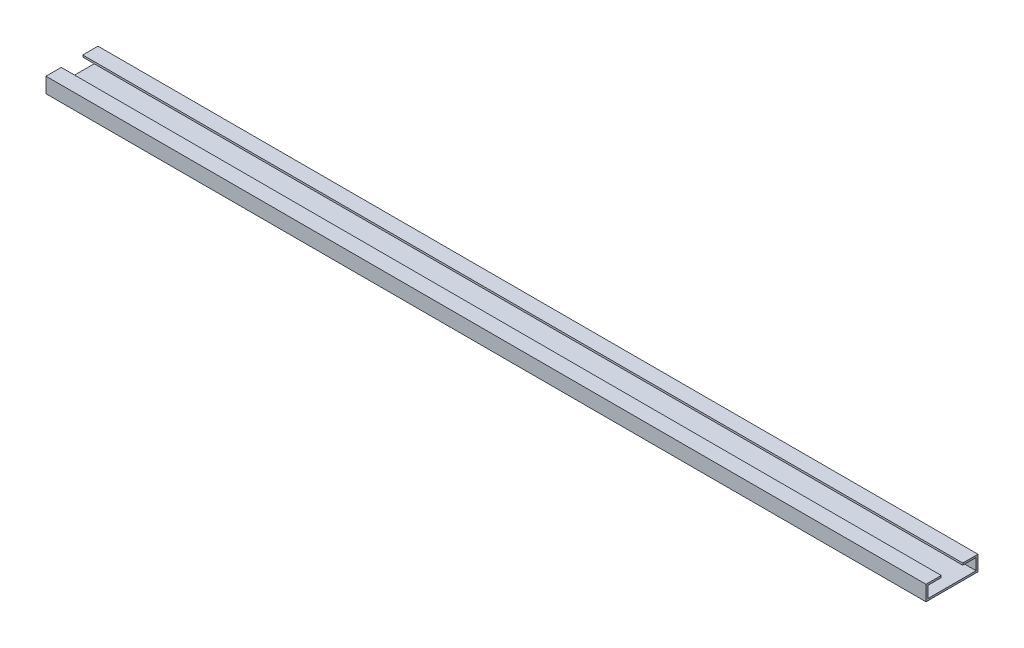
ISO-10303-21;
HEADER;
FILE_DESCRIPTION(('STEP AP214'),'2;1');
FILE_NAME('part.step','',(''),(''),'','','');
FILE_SCHEMA(('AUTOMOTIVE_DESIGN { 1 0 10303 214 1 1 1 1 }'));
ENDSEC;
DATA;
#1=APPLICATION_CONTEXT('core data for automotive mechanical design processes');
#2=APPLICATION_PROTOCOL_DEFINITION('international standard','automotive_design',2000,#1);
#3=PRODUCT_CONTEXT('',#1,'mechanical');
#4=PRODUCT('Part','Part','',(#3));
#5=PRODUCT_RELATED_PRODUCT_CATEGORY('part','',(#4));
#6=PRODUCT_DEFINITION_FORMATION('','',#4);
#7=PRODUCT_DEFINITION_CONTEXT('part definition',#1,'design');
#8=PRODUCT_DEFINITION('design','',#6,#7);
#9=PRODUCT_DEFINITION_SHAPE('','',#8);
#10=(LENGTH_UNIT() NAMED_UNIT(*) SI_UNIT(.MILLI.,.METRE.));
#11=(NAMED_UNIT(*) PLANE_ANGLE_UNIT() SI_UNIT($,.RADIAN.));
#12=(NAMED_UNIT(*) SI_UNIT($,.STERADIAN.) SOLID_ANGLE_UNIT());
#13=UNCERTAINTY_MEASURE_WITH_UNIT(LENGTH_MEASURE(1.E-05),#10,'distance_accuracy_value','');
#14=(GEOMETRIC_REPRESENTATION_CONTEXT(3) GLOBAL_UNCERTAINTY_ASSIGNED_CONTEXT((#13)) GLOBAL_UNIT_ASSIGNED_CONTEXT((#10,
#11,#12)) REPRESENTATION_CONTEXT('',''));
#15=CARTESIAN_POINT('',(0.,0.,0.));
#16=DIRECTION('',(0.,0.,1.));
#17=DIRECTION('',(1.,0.,0.));
#18=AXIS2_PLACEMENT_3D('',#15,#16,#17);
#19=CARTESIAN_POINT('',(370.,0.,-13.65));
#20=DIRECTION('',(0.,-1.,0.));
#21=DIRECTION('',(0.,0.,-1.));
#22=AXIS2_PLACEMENT_3D('',#19,#20,#21);
#23=PLANE('',#22);
#24=DIRECTION('',(-1.,0.,0.));
#25=VECTOR('',#24,1.);
#26=CARTESIAN_POINT('',(370.,0.,0.));
#27=LINE('',#26,#25);
#28=CARTESIAN_POINT('',(370.,0.,0.));
#29=VERTEX_POINT('',#28);
#30=CARTESIAN_POINT('',(139.,0.,0.));
#31=VERTEX_POINT('',#30);
#32=EDGE_CURVE('E36',#29,#31,#27,.T.);
#33=ORIENTED_EDGE('',*,*,#32,.T.);
#34=DIRECTION('',(0.,0.,1.));
#35=VECTOR('',#34,1.);
#36=CARTESIAN_POINT('',(139.,0.,-13.65));
#37=LINE('',#36,#35);
#38=CARTESIAN_POINT('',(139.,0.,-13.65));
#39=VERTEX_POINT('',#38);
#40=EDGE_CURVE('E49',#39,#31,#37,.T.);
#41=ORIENTED_EDGE('',*,*,#40,.F.);
#42=DIRECTION('',(-1.,0.,0.));
#43=VECTOR('',#42,1.);
#44=CARTESIAN_POINT('',(370.,0.,-13.65));
#45=LINE('',#44,#43);
#46=CARTESIAN_POINT('',(370.,0.,-13.65));
#47=VERTEX_POINT('',#46);
#48=EDGE_CURVE('E11',#47,#39,#45,.T.);
#49=ORIENTED_EDGE('',*,*,#48,.F.);
#50=DIRECTION('',(0.,0.,1.));
#51=VECTOR('',#50,1.);
#52=CARTESIAN_POINT('',(370.,0.,-13.65));
#53=LINE('',#52,#51);
#54=EDGE_CURVE('E198',#47,#29,#53,.T.);
#55=ORIENTED_EDGE('',*,*,#54,.T.);
#56=EDGE_LOOP('',(#33,#41,#49,#55));
#57=FACE_BOUND('',#56,.T.);
#58=ADVANCED_FACE('F33',(#57),#23,.T.);
#59=CARTESIAN_POINT('',(370.,4.,-13.65));
#60=DIRECTION('',(0.,0.,-1.));
#61=DIRECTION('',(-1.,0.,0.));
#62=AXIS2_PLACEMENT_3D('',#59,#60,#61);
#63=PLANE('',#62);
#64=ORIENTED_EDGE('',*,*,#48,.T.);
#65=DIRECTION('',(0.,-1.,0.));
#66=VECTOR('',#65,1.);
#67=CARTESIAN_POINT('',(139.,4.,-13.65));
#68=LINE('',#67,#66);
#69=CARTESIAN_POINT('',(139.,4.,-13.65));
#70=VERTEX_POINT('',#69);
#71=EDGE_CURVE('E123',#70,#39,#68,.T.);
#72=ORIENTED_EDGE('',*,*,#71,.F.);
#73=DIRECTION('',(-1.,0.,0.));
#74=VECTOR('',#73,1.);
#75=CARTESIAN_POINT('',(370.,4.,-13.65));
#76=LINE('',#75,#74);
#77=CARTESIAN_POINT('',(370.,4.,-13.65));
#78=VERTEX_POINT('',#77);
#79=EDGE_CURVE('E41',#78,#70,#76,.T.);
#80=ORIENTED_EDGE('',*,*,#79,.F.);
#81=DIRECTION('',(0.,-1.,0.));
#82=VECTOR('',#81,1.);
#83=CARTESIAN_POINT('',(370.,4.,-13.65));
#84=LINE('',#83,#82);
#85=EDGE_CURVE('E169',#78,#47,#84,.T.);
#86=ORIENTED_EDGE('',*,*,#85,.T.);
#87=EDGE_LOOP('',(#64,#72,#80,#86));
#88=FACE_BOUND('',#87,.T.);
#89=ADVANCED_FACE('F131',(#88),#63,.T.);
#90=CARTESIAN_POINT('',(370.,4.,-9.65));
#91=DIRECTION('',(0.,1.,0.));
#92=DIRECTION('',(0.,0.,1.));
#93=AXIS2_PLACEMENT_3D('',#90,#91,#92);
#94=PLANE('',#93);
#95=ORIENTED_EDGE('',*,*,#79,.T.);
#96=DIRECTION('',(0.,0.,-1.));
#97=VECTOR('',#96,1.);
#98=CARTESIAN_POINT('',(139.,4.,-9.65));
#99=LINE('',#98,#97);
#100=CARTESIAN_POINT('',(139.,4.,-9.65));
#101=VERTEX_POINT('',#100);
#102=EDGE_CURVE('E120',#101,#70,#99,.T.);
#103=ORIENTED_EDGE('',*,*,#102,.F.);
#104=DIRECTION('',(-1.,0.,0.));
#105=VECTOR('',#104,1.);
#106=CARTESIAN_POINT('',(370.,4.,-9.65));
#107=LINE('',#106,#105);
#108=CARTESIAN_POINT('',(370.,4.,-9.65));
#109=VERTEX_POINT('',#108);
#110=EDGE_CURVE('E139',#109,#101,#107,.T.);
#111=ORIENTED_EDGE('',*,*,#110,.F.);
#112=DIRECTION('',(0.,0.,-1.));
#113=VECTOR('',#112,1.);
#114=CARTESIAN_POINT('',(370.,4.,-9.65));
#115=LINE('',#114,#113);
#116=EDGE_CURVE('E137',#109,#78,#115,.T.);
#117=ORIENTED_EDGE('',*,*,#116,.T.);
#118=EDGE_LOOP('',(#95,#103,#111,#117));
#119=FACE_BOUND('',#118,.T.);
#120=ADVANCED_FACE('F135',(#119),#94,.T.);
#121=CARTESIAN_POINT('',(370.,3.5,-9.65));
#122=DIRECTION('',(0.,0.,1.));
#123=DIRECTION('',(1.,0.,0.));
#124=AXIS2_PLACEMENT_3D('',#121,#122,#123);
#125=PLANE('',#124);
#126=ORIENTED_EDGE('',*,*,#110,.T.);
#127=DIRECTION('',(0.,1.,0.));
#128=VECTOR('',#127,1.);
#129=CARTESIAN_POINT('',(139.,3.5,-9.65));
#130=LINE('',#129,#128);
#131=CARTESIAN_POINT('',(139.,3.5,-9.65));
#132=VERTEX_POINT('',#131);
#133=EDGE_CURVE('E125',#132,#101,#130,.T.);
#134=ORIENTED_EDGE('',*,*,#133,.F.);
#135=DIRECTION('',(-1.,0.,0.));
#136=VECTOR('',#135,1.);
#137=CARTESIAN_POINT('',(370.,3.5,-9.65));
#138=LINE('',#137,#136);
#139=CARTESIAN_POINT('',(370.,3.5,-9.65));
#140=VERTEX_POINT('',#139);
#141=EDGE_CURVE('E141',#140,#132,#138,.T.);
#142=ORIENTED_EDGE('',*,*,#141,.F.);
#143=DIRECTION('',(0.,1.,0.));
#144=VECTOR('',#143,1.);
#145=CARTESIAN_POINT('',(370.,3.5,-9.65));
#146=LINE('',#145,#144);
#147=EDGE_CURVE('E170',#140,#109,#146,.T.);
#148=ORIENTED_EDGE('',*,*,#147,.T.);
#149=EDGE_LOOP('',(#126,#134,#142,#148));
#150=FACE_BOUND('',#149,.T.);
#151=ADVANCED_FACE('F250',(#150),#125,.T.);
#152=CARTESIAN_POINT('',(370.,3.5,-13.15));
#153=DIRECTION('',(0.,-1.,0.));
#154=DIRECTION('',(0.,0.,-1.));
#155=AXIS2_PLACEMENT_3D('',#152,#153,#154);
#156=PLANE('',#155);
#157=ORIENTED_EDGE('',*,*,#141,.T.);
#158=DIRECTION('',(0.,0.,1.));
#159=VECTOR('',#158,1.);
#160=CARTESIAN_POINT('',(139.,3.5,-13.15));
#161=LINE('',#160,#159);
#162=CARTESIAN_POINT('',(139.,3.5,-13.15));
#163=VERTEX_POINT('',#162);
#164=EDGE_CURVE('E201',#163,#132,#161,.T.);
#165=ORIENTED_EDGE('',*,*,#164,.F.);
#166=DIRECTION('',(-1.,0.,0.));
#167=VECTOR('',#166,1.);
#168=CARTESIAN_POINT('',(370.,3.5,-13.15));
#169=LINE('',#168,#167);
#170=CARTESIAN_POINT('',(370.,3.5,-13.15));
#171=VERTEX_POINT('',#170);
#172=EDGE_CURVE('E147',#171,#163,#169,.T.);
#173=ORIENTED_EDGE('',*,*,#172,.F.);
#174=DIRECTION('',(0.,0.,1.));
#175=VECTOR('',#174,1.);
#176=CARTESIAN_POINT('',(370.,3.5,-13.15));
#177=LINE('',#176,#175);
#178=EDGE_CURVE('E175',#171,#140,#177,.T.);
#179=ORIENTED_EDGE('',*,*,#178,.T.);
#180=EDGE_LOOP('',(#157,#165,#173,#179));
#181=FACE_BOUND('',#180,.T.);
#182=ADVANCED_FACE('F248',(#181),#156,.T.);
#183=CARTESIAN_POINT('',(370.,0.5,-13.15));
#184=DIRECTION('',(0.,0.,1.));
#185=DIRECTION('',(1.,0.,0.));
#186=AXIS2_PLACEMENT_3D('',#183,#184,#185);
#187=PLANE('',#186);
#188=ORIENTED_EDGE('',*,*,#172,.T.);
#189=DIRECTION('',(0.,1.,0.));
#190=VECTOR('',#189,1.);
#191=CARTESIAN_POINT('',(139.,0.5,-13.15));
#192=LINE('',#191,#190);
#193=CARTESIAN_POINT('',(139.,0.5,-13.15));
#194=VERTEX_POINT('',#193);
#195=EDGE_CURVE('E203',#194,#163,#192,.T.);
#196=ORIENTED_EDGE('',*,*,#195,.F.);
#197=DIRECTION('',(-1.,0.,0.));
#198=VECTOR('',#197,1.);
#199=CARTESIAN_POINT('',(370.,0.5,-13.15));
#200=LINE('',#199,#198);
#201=CARTESIAN_POINT('',(370.,0.5,-13.15));
#202=VERTEX_POINT('',#201);
#203=EDGE_CURVE('E150',#202,#194,#200,.T.);
#204=ORIENTED_EDGE('',*,*,#203,.F.);
#205=DIRECTION('',(0.,1.,0.));
#206=VECTOR('',#205,1.);
#207=CARTESIAN_POINT('',(370.,0.5,-13.15));
#208=LINE('',#207,#206);
#209=EDGE_CURVE('E178',#202,#171,#208,.T.);
#210=ORIENTED_EDGE('',*,*,#209,.T.);
#211=EDGE_LOOP('',(#188,#196,#204,#210));
#212=FACE_BOUND('',#211,.T.);
#213=ADVANCED_FACE('F244',(#212),#187,.T.);
#214=CARTESIAN_POINT('',(370.,0.5,-0.5));
#215=DIRECTION('',(0.,1.,0.));
#216=DIRECTION('',(0.,0.,1.));
#217=AXIS2_PLACEMENT_3D('',#214,#215,#216);
#218=PLANE('',#217);
#219=ORIENTED_EDGE('',*,*,#203,.T.);
#220=DIRECTION('',(0.,0.,-1.));
#221=VECTOR('',#220,1.);
#222=CARTESIAN_POINT('',(139.,0.5,-0.5));
#223=LINE('',#222,#221);
#224=CARTESIAN_POINT('',(139.,0.5,-0.5));
#225=VERTEX_POINT('',#224);
#226=EDGE_CURVE('E205',#225,#194,#223,.T.);
#227=ORIENTED_EDGE('',*,*,#226,.F.);
#228=DIRECTION('',(-1.,0.,0.));
#229=VECTOR('',#228,1.);
#230=CARTESIAN_POINT('',(370.,0.5,-0.5));
#231=LINE('',#230,#229);
#232=CARTESIAN_POINT('',(370.,0.5,-0.5));
#233=VERTEX_POINT('',#232);
#234=EDGE_CURVE('E153',#233,#225,#231,.T.);
#235=ORIENTED_EDGE('',*,*,#234,.F.);
#236=DIRECTION('',(0.,0.,-1.));
#237=VECTOR('',#236,1.);
#238=CARTESIAN_POINT('',(370.,0.5,-0.5));
#239=LINE('',#238,#237);
#240=EDGE_CURVE('E181',#233,#202,#239,.T.);
#241=ORIENTED_EDGE('',*,*,#240,.T.);
#242=EDGE_LOOP('',(#219,#227,#235,#241));
#243=FACE_BOUND('',#242,.T.);
#244=ADVANCED_FACE('F239',(#243),#218,.T.);
#245=CARTESIAN_POINT('',(370.,3.5,-0.5));
#246=DIRECTION('',(0.,0.,-1.));
#247=DIRECTION('',(0.,1.,0.));
#248=AXIS2_PLACEMENT_3D('',#245,#246,#247);
#249=PLANE('',#248);
#250=ORIENTED_EDGE('',*,*,#234,.T.);
#251=DIRECTION('',(0.,-1.,0.));
#252=VECTOR('',#251,1.);
#253=CARTESIAN_POINT('',(139.,3.5,-0.5));
#254=LINE('',#253,#252);
#255=CARTESIAN_POINT('',(139.,3.5,-0.5));
#256=VERTEX_POINT('',#255);
#257=EDGE_CURVE('E207',#256,#225,#254,.T.);
#258=ORIENTED_EDGE('',*,*,#257,.F.);
#259=DIRECTION('',(-1.,0.,0.));
#260=VECTOR('',#259,1.);
#261=CARTESIAN_POINT('',(370.,3.5,-0.5));
#262=LINE('',#261,#260);
#263=CARTESIAN_POINT('',(370.,3.5,-0.5));
#264=VERTEX_POINT('',#263);
#265=EDGE_CURVE('E156',#264,#256,#262,.T.);
#266=ORIENTED_EDGE('',*,*,#265,.F.);
#267=DIRECTION('',(0.,-1.,0.));
#268=VECTOR('',#267,1.);
#269=CARTESIAN_POINT('',(370.,3.5,-0.5));
#270=LINE('',#269,#268);
#271=EDGE_CURVE('E184',#264,#233,#270,.T.);
#272=ORIENTED_EDGE('',*,*,#271,.T.);
#273=EDGE_LOOP('',(#250,#258,#266,#272));
#274=FACE_BOUND('',#273,.T.);
#275=ADVANCED_FACE('F237',(#274),#249,.T.);
#276=CARTESIAN_POINT('',(370.,3.5,-4.));
#277=DIRECTION('',(0.,-1.,0.));
#278=DIRECTION('',(0.,0.,-1.));
#279=AXIS2_PLACEMENT_3D('',#276,#277,#278);
#280=PLANE('',#279);
#281=ORIENTED_EDGE('',*,*,#265,.T.);
#282=DIRECTION('',(0.,0.,1.));
#283=VECTOR('',#282,1.);
#284=CARTESIAN_POINT('',(139.,3.5,-4.));
#285=LINE('',#284,#283);
#286=CARTESIAN_POINT('',(139.,3.5,-4.));
#287=VERTEX_POINT('',#286);
#288=EDGE_CURVE('E209',#287,#256,#285,.T.);
#289=ORIENTED_EDGE('',*,*,#288,.F.);
#290=DIRECTION('',(-1.,0.,0.));
#291=VECTOR('',#290,1.);
#292=CARTESIAN_POINT('',(370.,3.5,-4.));
#293=LINE('',#292,#291);
#294=CARTESIAN_POINT('',(370.,3.5,-4.));
#295=VERTEX_POINT('',#294);
#296=EDGE_CURVE('E159',#295,#287,#293,.T.);
#297=ORIENTED_EDGE('',*,*,#296,.F.);
#298=DIRECTION('',(0.,0.,1.));
#299=VECTOR('',#298,1.);
#300=CARTESIAN_POINT('',(370.,3.5,-4.));
#301=LINE('',#300,#299);
#302=EDGE_CURVE('E187',#295,#264,#301,.T.);
#303=ORIENTED_EDGE('',*,*,#302,.T.);
#304=EDGE_LOOP('',(#281,#289,#297,#303));
#305=FACE_BOUND('',#304,.T.);
#306=ADVANCED_FACE('F232',(#305),#280,.T.);
#307=CARTESIAN_POINT('',(370.,4.,-4.));
#308=DIRECTION('',(0.,0.,-1.));
#309=DIRECTION('',(-1.,0.,0.));
#310=AXIS2_PLACEMENT_3D('',#307,#308,#309);
#311=PLANE('',#310);
#312=ORIENTED_EDGE('',*,*,#296,.T.);
#313=DIRECTION('',(0.,-1.,0.));
#314=VECTOR('',#313,1.);
#315=CARTESIAN_POINT('',(139.,4.,-4.));
#316=LINE('',#315,#314);
#317=CARTESIAN_POINT('',(139.,4.,-4.));
#318=VERTEX_POINT('',#317);
#319=EDGE_CURVE('E211',#318,#287,#316,.T.);
#320=ORIENTED_EDGE('',*,*,#319,.F.);
#321=DIRECTION('',(-1.,0.,0.));
#322=VECTOR('',#321,1.);
#323=CARTESIAN_POINT('',(370.,4.,-4.));
#324=LINE('',#323,#322);
#325=CARTESIAN_POINT('',(370.,4.,-4.));
#326=VERTEX_POINT('',#325);
#327=EDGE_CURVE('E162',#326,#318,#324,.T.);
#328=ORIENTED_EDGE('',*,*,#327,.F.);
#329=DIRECTION('',(0.,-1.,0.));
#330=VECTOR('',#329,1.);
#331=CARTESIAN_POINT('',(370.,4.,-4.));
#332=LINE('',#331,#330);
#333=EDGE_CURVE('E190',#326,#295,#332,.T.);
#334=ORIENTED_EDGE('',*,*,#333,.T.);
#335=EDGE_LOOP('',(#312,#320,#328,#334));
#336=FACE_BOUND('',#335,.T.);
#337=ADVANCED_FACE('F224',(#336),#311,.T.);
#338=CARTESIAN_POINT('',(370.,4.,0.));
#339=DIRECTION('',(0.,1.,0.));
#340=DIRECTION('',(0.,0.,1.));
#341=AXIS2_PLACEMENT_3D('',#338,#339,#340);
#342=PLANE('',#341);
#343=ORIENTED_EDGE('',*,*,#327,.T.);
#344=DIRECTION('',(0.,0.,-1.));
#345=VECTOR('',#344,1.);
#346=CARTESIAN_POINT('',(139.,4.,0.));
#347=LINE('',#346,#345);
#348=CARTESIAN_POINT('',(139.,4.,0.));
#349=VERTEX_POINT('',#348);
#350=EDGE_CURVE('E213',#349,#318,#347,.T.);
#351=ORIENTED_EDGE('',*,*,#350,.F.);
#352=DIRECTION('',(-1.,0.,0.));
#353=VECTOR('',#352,1.);
#354=CARTESIAN_POINT('',(370.,4.,0.));
#355=LINE('',#354,#353);
#356=CARTESIAN_POINT('',(370.,4.,0.));
#357=VERTEX_POINT('',#356);
#358=EDGE_CURVE('E164',#357,#349,#355,.T.);
#359=ORIENTED_EDGE('',*,*,#358,.F.);
#360=DIRECTION('',(0.,0.,-1.));
#361=VECTOR('',#360,1.);
#362=CARTESIAN_POINT('',(370.,4.,0.));
#363=LINE('',#362,#361);
#364=EDGE_CURVE('E193',#357,#326,#363,.T.);
#365=ORIENTED_EDGE('',*,*,#364,.T.);
#366=EDGE_LOOP('',(#343,#351,#359,#365));
#367=FACE_BOUND('',#366,.T.);
#368=ADVANCED_FACE('F220',(#367),#342,.T.);
#369=CARTESIAN_POINT('',(370.,0.,0.));
#370=DIRECTION('',(0.,0.,1.));
#371=DIRECTION('',(1.,0.,0.));
#372=AXIS2_PLACEMENT_3D('',#369,#370,#371);
#373=PLANE('',#372);
#374=ORIENTED_EDGE('',*,*,#358,.T.);
#375=DIRECTION('',(0.,1.,0.));
#376=VECTOR('',#375,1.);
#377=CARTESIAN_POINT('',(139.,0.,0.));
#378=LINE('',#377,#376);
#379=EDGE_CURVE('E215',#31,#349,#378,.T.);
#380=ORIENTED_EDGE('',*,*,#379,.F.);
#381=ORIENTED_EDGE('',*,*,#32,.F.);
#382=DIRECTION('',(0.,1.,0.));
#383=VECTOR('',#382,1.);
#384=CARTESIAN_POINT('',(370.,0.,0.));
#385=LINE('',#384,#383);
#386=EDGE_CURVE('E196',#29,#357,#385,.T.);
#387=ORIENTED_EDGE('',*,*,#386,.T.);
#388=EDGE_LOOP('',(#374,#380,#381,#387));
#389=FACE_BOUND('',#388,.T.);
#390=ADVANCED_FACE('F278',(#389),#373,.T.);
#391=CARTESIAN_POINT('',(370.,0.,0.));
#392=DIRECTION('',(-1.,0.,0.));
#393=DIRECTION('',(0.,0.,1.));
#394=AXIS2_PLACEMENT_3D('',#391,#392,#393);
#395=PLANE('',#394);
#396=ORIENTED_EDGE('',*,*,#54,.F.);
#397=ORIENTED_EDGE('',*,*,#85,.F.);
#398=ORIENTED_EDGE('',*,*,#116,.F.);
#399=ORIENTED_EDGE('',*,*,#147,.F.);
#400=ORIENTED_EDGE('',*,*,#178,.F.);
#401=ORIENTED_EDGE('',*,*,#209,.F.);
#402=ORIENTED_EDGE('',*,*,#240,.F.);
#403=ORIENTED_EDGE('',*,*,#271,.F.);
#404=ORIENTED_EDGE('',*,*,#302,.F.);
#405=ORIENTED_EDGE('',*,*,#333,.F.);
#406=ORIENTED_EDGE('',*,*,#364,.F.);
#407=ORIENTED_EDGE('',*,*,#386,.F.);
#408=EDGE_LOOP('',(#396,#397,#398,#399,#400,#401,#402,#403,#404,#405,#406,#407));
#409=FACE_BOUND('',#408,.T.);
#410=ADVANCED_FACE('F227',(#409),#395,.F.);
#411=CARTESIAN_POINT('',(139.,0.,0.));
#412=DIRECTION('',(-1.,0.,0.));
#413=DIRECTION('',(0.,0.,1.));
#414=AXIS2_PLACEMENT_3D('',#411,#412,#413);
#415=PLANE('',#414);
#416=ORIENTED_EDGE('',*,*,#102,.T.);
#417=ORIENTED_EDGE('',*,*,#71,.T.);
#418=ORIENTED_EDGE('',*,*,#40,.T.);
#419=ORIENTED_EDGE('',*,*,#379,.T.);
#420=ORIENTED_EDGE('',*,*,#350,.T.);
#421=ORIENTED_EDGE('',*,*,#319,.T.);
#422=ORIENTED_EDGE('',*,*,#288,.T.);
#423=ORIENTED_EDGE('',*,*,#257,.T.);
#424=ORIENTED_EDGE('',*,*,#226,.T.);
#425=ORIENTED_EDGE('',*,*,#195,.T.);
#426=ORIENTED_EDGE('',*,*,#164,.T.);
#427=ORIENTED_EDGE('',*,*,#133,.T.);
#428=EDGE_LOOP('',(#416,#417,#418,#419,#420,#421,#422,#423,#424,#425,#426,#427));
#429=FACE_BOUND('',#428,.T.);
#430=ADVANCED_FACE('F122',(#429),#415,.T.);
#431=CLOSED_SHELL('',(#58,#89,#120,#151,#182,#213,#244,#275,#306,#337,#368,#390,#410,#430));
#432=MANIFOLD_SOLID_BREP('B2',#431);
#433=ADVANCED_BREP_SHAPE_REPRESENTATION('',(#18,#432),#14);
#434=SHAPE_DEFINITION_REPRESENTATION(#9,#433);
ENDSEC;
END-ISO-10303-21;
